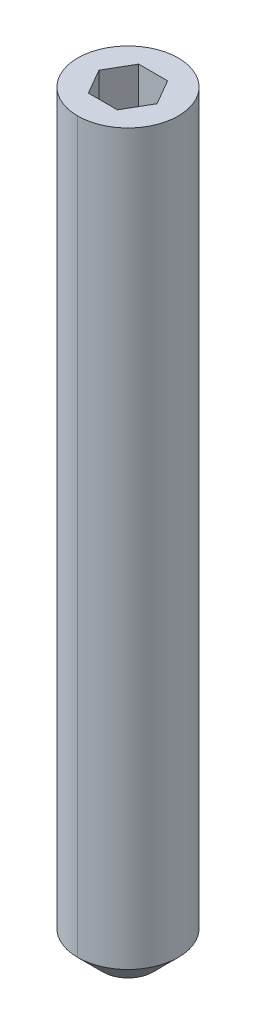
ISO-10303-21;
HEADER;
FILE_DESCRIPTION(('STEP AP214'),'2;1');
FILE_NAME('part.step','',(''),(''),'','','');
FILE_SCHEMA(('AUTOMOTIVE_DESIGN { 1 0 10303 214 1 1 1 1 }'));
ENDSEC;
DATA;
#1=APPLICATION_CONTEXT('core data for automotive mechanical design processes');
#2=APPLICATION_PROTOCOL_DEFINITION('international standard','automotive_design',2000,#1);
#3=PRODUCT_CONTEXT('',#1,'mechanical');
#4=PRODUCT('Part','Part','',(#3));
#5=PRODUCT_RELATED_PRODUCT_CATEGORY('part','',(#4));
#6=PRODUCT_DEFINITION_FORMATION('','',#4);
#7=PRODUCT_DEFINITION_CONTEXT('part definition',#1,'design');
#8=PRODUCT_DEFINITION('design','',#6,#7);
#9=PRODUCT_DEFINITION_SHAPE('','',#8);
#10=(LENGTH_UNIT() NAMED_UNIT(*) SI_UNIT(.MILLI.,.METRE.));
#11=(NAMED_UNIT(*) PLANE_ANGLE_UNIT() SI_UNIT($,.RADIAN.));
#12=(NAMED_UNIT(*) SI_UNIT($,.STERADIAN.) SOLID_ANGLE_UNIT());
#13=UNCERTAINTY_MEASURE_WITH_UNIT(LENGTH_MEASURE(1.E-05),#10,'distance_accuracy_value','');
#14=(GEOMETRIC_REPRESENTATION_CONTEXT(3) GLOBAL_UNCERTAINTY_ASSIGNED_CONTEXT((#13)) GLOBAL_UNIT_ASSIGNED_CONTEXT((#10,
#11,#12)) REPRESENTATION_CONTEXT('',''));
#15=CARTESIAN_POINT('',(0.,0.,0.));
#16=DIRECTION('',(0.,0.,1.));
#17=DIRECTION('',(1.,0.,0.));
#18=AXIS2_PLACEMENT_3D('',#15,#16,#17);
#19=CARTESIAN_POINT('',(0.577350269189626,26.,1.));
#20=DIRECTION('',(0.866025403784438,0.,0.5));
#21=DIRECTION('',(0.5,0.,-0.866025403784438));
#22=AXIS2_PLACEMENT_3D('',#19,#20,#21);
#23=PLANE('',#22);
#24=DIRECTION('',(0.5,0.,-0.866025403784438));
#25=VECTOR('',#24,1.);
#26=CARTESIAN_POINT('',(0.577350269189626,26.,1.));
#27=LINE('',#26,#25);
#28=CARTESIAN_POINT('',(0.577350269189626,26.,1.));
#29=VERTEX_POINT('',#28);
#30=CARTESIAN_POINT('',(1.15470053837925,26.,0.));
#31=VERTEX_POINT('',#30);
#32=EDGE_CURVE('E144',#29,#31,#27,.T.);
#33=ORIENTED_EDGE('',*,*,#32,.F.);
#34=DIRECTION('',(0.,1.,0.));
#35=VECTOR('',#34,1.);
#36=CARTESIAN_POINT('',(0.577350269189626,26.,1.));
#37=LINE('',#36,#35);
#38=CARTESIAN_POINT('',(0.577350269189626,30.,1.));
#39=VERTEX_POINT('',#38);
#40=EDGE_CURVE('E132',#29,#39,#37,.T.);
#41=ORIENTED_EDGE('',*,*,#40,.T.);
#42=DIRECTION('',(0.5,0.,-0.866025403784438));
#43=VECTOR('',#42,1.);
#44=CARTESIAN_POINT('',(0.577350269189626,30.,1.));
#45=LINE('',#44,#43);
#46=CARTESIAN_POINT('',(1.15470053837925,30.,0.));
#47=VERTEX_POINT('',#46);
#48=EDGE_CURVE('E146',#47,#39,#45,.F.);
#49=ORIENTED_EDGE('',*,*,#48,.F.);
#50=DIRECTION('',(0.,1.,0.));
#51=VECTOR('',#50,1.);
#52=CARTESIAN_POINT('',(1.15470053837925,26.,0.));
#53=LINE('',#52,#51);
#54=EDGE_CURVE('E139',#47,#31,#53,.F.);
#55=ORIENTED_EDGE('',*,*,#54,.T.);
#56=EDGE_LOOP('',(#33,#41,#49,#55));
#57=FACE_BOUND('',#56,.T.);
#58=ADVANCED_FACE('F17',(#57),#23,.F.);
#59=CARTESIAN_POINT('',(1.15470053837925,26.,0.));
#60=DIRECTION('',(0.866025403784438,0.,-0.5));
#61=DIRECTION('',(-0.5,0.,-0.866025403784438));
#62=AXIS2_PLACEMENT_3D('',#59,#60,#61);
#63=PLANE('',#62);
#64=DIRECTION('',(-0.5,0.,-0.866025403784438));
#65=VECTOR('',#64,1.);
#66=CARTESIAN_POINT('',(1.15470053837925,26.,0.));
#67=LINE('',#66,#65);
#68=CARTESIAN_POINT('',(0.577350269189626,26.,-1.));
#69=VERTEX_POINT('',#68);
#70=EDGE_CURVE('E137',#31,#69,#67,.T.);
#71=ORIENTED_EDGE('',*,*,#70,.F.);
#72=ORIENTED_EDGE('',*,*,#54,.F.);
#73=DIRECTION('',(-0.5,0.,-0.866025403784438));
#74=VECTOR('',#73,1.);
#75=CARTESIAN_POINT('',(1.15470053837925,30.,0.));
#76=LINE('',#75,#74);
#77=CARTESIAN_POINT('',(0.577350269189625,30.,-1.));
#78=VERTEX_POINT('',#77);
#79=EDGE_CURVE('E142',#78,#47,#76,.F.);
#80=ORIENTED_EDGE('',*,*,#79,.F.);
#81=DIRECTION('',(0.,1.,0.));
#82=VECTOR('',#81,1.);
#83=CARTESIAN_POINT('',(0.577350269189625,26.,-1.));
#84=LINE('',#83,#82);
#85=EDGE_CURVE('E127',#78,#69,#84,.F.);
#86=ORIENTED_EDGE('',*,*,#85,.T.);
#87=EDGE_LOOP('',(#71,#72,#80,#86));
#88=FACE_BOUND('',#87,.T.);
#89=ADVANCED_FACE('F179',(#88),#63,.F.);
#90=CARTESIAN_POINT('',(-0.577350269189626,26.,1.));
#91=DIRECTION('',(0.,0.,1.));
#92=DIRECTION('',(1.,0.,0.));
#93=AXIS2_PLACEMENT_3D('',#90,#91,#92);
#94=PLANE('',#93);
#95=DIRECTION('',(1.,0.,0.));
#96=VECTOR('',#95,1.);
#97=CARTESIAN_POINT('',(1.15470053837925,26.,1.));
#98=LINE('',#97,#96);
#99=CARTESIAN_POINT('',(-0.577350269189626,26.,1.));
#100=VERTEX_POINT('',#99);
#101=EDGE_CURVE('E124',#100,#29,#98,.T.);
#102=ORIENTED_EDGE('',*,*,#101,.F.);
#103=DIRECTION('',(0.,1.,0.));
#104=VECTOR('',#103,1.);
#105=CARTESIAN_POINT('',(-0.577350269189626,26.,1.));
#106=LINE('',#105,#104);
#107=CARTESIAN_POINT('',(-0.577350269189626,30.,1.));
#108=VERTEX_POINT('',#107);
#109=EDGE_CURVE('E113',#100,#108,#106,.T.);
#110=ORIENTED_EDGE('',*,*,#109,.T.);
#111=DIRECTION('',(1.,0.,0.));
#112=VECTOR('',#111,1.);
#113=CARTESIAN_POINT('',(-0.577350269189626,30.,1.));
#114=LINE('',#113,#112);
#115=EDGE_CURVE('E135',#39,#108,#114,.F.);
#116=ORIENTED_EDGE('',*,*,#115,.F.);
#117=ORIENTED_EDGE('',*,*,#40,.F.);
#118=EDGE_LOOP('',(#102,#110,#116,#117));
#119=FACE_BOUND('',#118,.T.);
#120=ADVANCED_FACE('F185',(#119),#94,.F.);
#121=CARTESIAN_POINT('',(0.577350269189625,26.,-1.));
#122=DIRECTION('',(0.,0.,-1.));
#123=DIRECTION('',(-1.,0.,0.));
#124=AXIS2_PLACEMENT_3D('',#121,#122,#123);
#125=PLANE('',#124);
#126=DIRECTION('',(1.,0.,0.));
#127=VECTOR('',#126,1.);
#128=CARTESIAN_POINT('',(1.15470053837925,26.,-1.));
#129=LINE('',#128,#127);
#130=CARTESIAN_POINT('',(-0.577350269189626,26.,-1.));
#131=VERTEX_POINT('',#130);
#132=EDGE_CURVE('E121',#69,#131,#129,.F.);
#133=ORIENTED_EDGE('',*,*,#132,.F.);
#134=ORIENTED_EDGE('',*,*,#85,.F.);
#135=DIRECTION('',(-1.,0.,0.));
#136=VECTOR('',#135,1.);
#137=CARTESIAN_POINT('',(0.577350269189625,30.,-1.));
#138=LINE('',#137,#136);
#139=CARTESIAN_POINT('',(-0.577350269189626,30.,-1.));
#140=VERTEX_POINT('',#139);
#141=EDGE_CURVE('E130',#140,#78,#138,.F.);
#142=ORIENTED_EDGE('',*,*,#141,.F.);
#143=DIRECTION('',(0.,1.,0.));
#144=VECTOR('',#143,1.);
#145=CARTESIAN_POINT('',(-0.577350269189626,26.,-1.));
#146=LINE('',#145,#144);
#147=EDGE_CURVE('E111',#140,#131,#146,.F.);
#148=ORIENTED_EDGE('',*,*,#147,.T.);
#149=EDGE_LOOP('',(#133,#134,#142,#148));
#150=FACE_BOUND('',#149,.T.);
#151=ADVANCED_FACE('F171',(#150),#125,.F.);
#152=CARTESIAN_POINT('',(1.15470053837925,26.,0.));
#153=DIRECTION('',(0.,1.,0.));
#154=DIRECTION('',(0.,0.,1.));
#155=AXIS2_PLACEMENT_3D('',#152,#153,#154);
#156=PLANE('',#155);
#157=ORIENTED_EDGE('',*,*,#132,.T.);
#158=DIRECTION('',(-0.5,0.,0.866025403784439));
#159=VECTOR('',#158,1.);
#160=CARTESIAN_POINT('',(-0.577350269189626,26.,-1.));
#161=LINE('',#160,#159);
#162=CARTESIAN_POINT('',(-1.15470053837925,26.,0.));
#163=VERTEX_POINT('',#162);
#164=EDGE_CURVE('E109',#131,#163,#161,.T.);
#165=ORIENTED_EDGE('',*,*,#164,.T.);
#166=DIRECTION('',(0.5,0.,0.866025403784439));
#167=VECTOR('',#166,1.);
#168=CARTESIAN_POINT('',(-1.15470053837925,26.,0.));
#169=LINE('',#168,#167);
#170=EDGE_CURVE('E116',#163,#100,#169,.T.);
#171=ORIENTED_EDGE('',*,*,#170,.T.);
#172=ORIENTED_EDGE('',*,*,#101,.T.);
#173=ORIENTED_EDGE('',*,*,#32,.T.);
#174=ORIENTED_EDGE('',*,*,#70,.T.);
#175=EDGE_LOOP('',(#157,#165,#171,#172,#173,#174));
#176=FACE_BOUND('',#175,.T.);
#177=ADVANCED_FACE('F174',(#176),#156,.T.);
#178=CARTESIAN_POINT('',(-1.15470053837925,26.,0.));
#179=DIRECTION('',(-0.866025403784439,0.,0.5));
#180=DIRECTION('',(0.5,0.,0.866025403784439));
#181=AXIS2_PLACEMENT_3D('',#178,#179,#180);
#182=PLANE('',#181);
#183=ORIENTED_EDGE('',*,*,#170,.F.);
#184=DIRECTION('',(0.,1.,0.));
#185=VECTOR('',#184,1.);
#186=CARTESIAN_POINT('',(-1.15470053837925,26.,0.));
#187=LINE('',#186,#185);
#188=CARTESIAN_POINT('',(-1.15470053837925,30.,0.));
#189=VERTEX_POINT('',#188);
#190=EDGE_CURVE('E94',#163,#189,#187,.T.);
#191=ORIENTED_EDGE('',*,*,#190,.T.);
#192=DIRECTION('',(0.5,0.,0.866025403784439));
#193=VECTOR('',#192,1.);
#194=CARTESIAN_POINT('',(-1.15470053837925,30.,0.));
#195=LINE('',#194,#193);
#196=EDGE_CURVE('E119',#108,#189,#195,.F.);
#197=ORIENTED_EDGE('',*,*,#196,.F.);
#198=ORIENTED_EDGE('',*,*,#109,.F.);
#199=EDGE_LOOP('',(#183,#191,#197,#198));
#200=FACE_BOUND('',#199,.T.);
#201=ADVANCED_FACE('F188',(#200),#182,.F.);
#202=CARTESIAN_POINT('',(-0.577350269189626,26.,-1.));
#203=DIRECTION('',(-0.866025403784439,0.,-0.5));
#204=DIRECTION('',(-0.5,0.,0.866025403784439));
#205=AXIS2_PLACEMENT_3D('',#202,#203,#204);
#206=PLANE('',#205);
#207=ORIENTED_EDGE('',*,*,#164,.F.);
#208=ORIENTED_EDGE('',*,*,#147,.F.);
#209=DIRECTION('',(0.5,0.,-0.866025403784439));
#210=VECTOR('',#209,1.);
#211=CARTESIAN_POINT('',(-1.15470053837925,30.,0.));
#212=LINE('',#211,#210);
#213=EDGE_CURVE('E91',#189,#140,#212,.T.);
#214=ORIENTED_EDGE('',*,*,#213,.F.);
#215=ORIENTED_EDGE('',*,*,#190,.F.);
#216=EDGE_LOOP('',(#207,#208,#214,#215));
#217=FACE_BOUND('',#216,.T.);
#218=ADVANCED_FACE('F168',(#217),#206,.F.);
#219=CARTESIAN_POINT('',(0.,0.,0.));
#220=DIRECTION('',(0.,-1.,0.));
#221=DIRECTION('',(0.,0.,-1.));
#222=AXIS2_PLACEMENT_3D('',#219,#220,#221);
#223=PLANE('',#222);
#224=CARTESIAN_POINT('',(0.,5.6843418860808E-11,0.));
#225=DIRECTION('',(0.,1.,0.));
#226=DIRECTION('',(0.,0.,1.));
#227=AXIS2_PLACEMENT_3D('',#224,#225,#226);
#228=CIRCLE('',#227,0.999999999862666);
#229=CARTESIAN_POINT('',(0.,5.6843418860808E-11,0.999999999862666));
#230=VERTEX_POINT('',#229);
#231=CARTESIAN_POINT('',(0.,5.6843418860808E-11,-0.999999999862666));
#232=VERTEX_POINT('',#231);
#233=EDGE_CURVE('E86',#230,#232,#228,.T.);
#234=ORIENTED_EDGE('',*,*,#233,.F.);
#235=CARTESIAN_POINT('',(0.,5.6843418860808E-11,0.));
#236=DIRECTION('',(0.,1.,0.));
#237=DIRECTION('',(0.,0.,1.));
#238=AXIS2_PLACEMENT_3D('',#235,#236,#237);
#239=CIRCLE('',#238,0.999999999862666);
#240=EDGE_CURVE('E20',#232,#230,#239,.T.);
#241=ORIENTED_EDGE('',*,*,#240,.F.);
#242=EDGE_LOOP('',(#234,#241));
#243=FACE_BOUND('',#242,.T.);
#244=ADVANCED_FACE('F87',(#243),#223,.T.);
#245=CARTESIAN_POINT('',(0.,1.0000000000332,0.));
#246=DIRECTION('',(0.,1.,0.));
#247=DIRECTION('',(0.,0.,1.));
#248=AXIS2_PLACEMENT_3D('',#245,#246,#247);
#249=CONICAL_SURFACE('',#248,1.99999999989586,0.78539816342587);
#250=DIRECTION('',(0.,-0.707106781186548,-0.707106781186547));
#251=VECTOR('',#250,1.);
#252=CARTESIAN_POINT('',(0.,498999.,499000.));
#253=LINE('',#252,#251);
#254=CARTESIAN_POINT('',(0.,1.00000000002075,1.99999999993491));
#255=VERTEX_POINT('',#254);
#256=EDGE_CURVE('E93',#255,#230,#253,.T.);
#257=ORIENTED_EDGE('',*,*,#256,.F.);
#258=CARTESIAN_POINT('',(0.,1.,0.));
#259=DIRECTION('',(0.,-1.,0.));
#260=DIRECTION('',(0.,0.,-1.));
#261=AXIS2_PLACEMENT_3D('',#258,#259,#260);
#262=CIRCLE('',#261,2.);
#263=CARTESIAN_POINT('',(0.,1.0000000000249,-1.9999999999219));
#264=VERTEX_POINT('',#263);
#265=EDGE_CURVE('E35',#264,#255,#262,.F.);
#266=ORIENTED_EDGE('',*,*,#265,.F.);
#267=DIRECTION('',(0.,-0.707106781186548,0.707106781186547));
#268=VECTOR('',#267,1.);
#269=CARTESIAN_POINT('',(6.11098752774529E-11,498999.,-499000.));
#270=LINE('',#269,#268);
#271=EDGE_CURVE('E90',#232,#264,#270,.F.);
#272=ORIENTED_EDGE('',*,*,#271,.F.);
#273=ORIENTED_EDGE('',*,*,#240,.T.);
#274=EDGE_LOOP('',(#257,#266,#272,#273));
#275=FACE_BOUND('',#274,.T.);
#276=ADVANCED_FACE('F92',(#275),#249,.T.);
#277=CARTESIAN_POINT('',(0.,30.,-2.));
#278=DIRECTION('',(0.,1.,0.));
#279=DIRECTION('',(0.,0.,1.));
#280=AXIS2_PLACEMENT_3D('',#277,#278,#279);
#281=PLANE('',#280);
#282=ORIENTED_EDGE('',*,*,#196,.T.);
#283=ORIENTED_EDGE('',*,*,#213,.T.);
#284=ORIENTED_EDGE('',*,*,#141,.T.);
#285=ORIENTED_EDGE('',*,*,#79,.T.);
#286=ORIENTED_EDGE('',*,*,#48,.T.);
#287=ORIENTED_EDGE('',*,*,#115,.T.);
#288=EDGE_LOOP('',(#282,#283,#284,#285,#286,#287));
#289=FACE_BOUND('',#288,.T.);
#290=CARTESIAN_POINT('',(0.,30.,0.));
#291=DIRECTION('',(0.,-1.,0.));
#292=DIRECTION('',(0.,0.,-1.));
#293=AXIS2_PLACEMENT_3D('',#290,#291,#292);
#294=CIRCLE('',#293,2.);
#295=CARTESIAN_POINT('',(0.,30.,-2.));
#296=VERTEX_POINT('',#295);
#297=CARTESIAN_POINT('',(0.,30.,2.));
#298=VERTEX_POINT('',#297);
#299=EDGE_CURVE('E148',#296,#298,#294,.T.);
#300=ORIENTED_EDGE('',*,*,#299,.F.);
#301=CARTESIAN_POINT('',(0.,30.,0.));
#302=DIRECTION('',(0.,-1.,0.));
#303=DIRECTION('',(0.,0.,-1.));
#304=AXIS2_PLACEMENT_3D('',#301,#302,#303);
#305=CIRCLE('',#304,2.);
#306=EDGE_CURVE('E99',#298,#296,#305,.T.);
#307=ORIENTED_EDGE('',*,*,#306,.F.);
#308=EDGE_LOOP('',(#300,#307));
#309=FACE_BOUND('',#308,.T.);
#310=ADVANCED_FACE('F160',(#289,#309),#281,.T.);
#311=CARTESIAN_POINT('',(0.,1.0000000000332,0.));
#312=DIRECTION('',(0.,1.,0.));
#313=DIRECTION('',(0.,0.,1.));
#314=AXIS2_PLACEMENT_3D('',#311,#312,#313);
#315=CONICAL_SURFACE('',#314,1.99999999989586,0.78539816342587);
#316=CARTESIAN_POINT('',(0.,1.,0.));
#317=DIRECTION('',(0.,-1.,0.));
#318=DIRECTION('',(0.,0.,-1.));
#319=AXIS2_PLACEMENT_3D('',#316,#317,#318);
#320=CIRCLE('',#319,2.);
#321=EDGE_CURVE('E26',#255,#264,#320,.F.);
#322=ORIENTED_EDGE('',*,*,#321,.F.);
#323=ORIENTED_EDGE('',*,*,#256,.T.);
#324=ORIENTED_EDGE('',*,*,#233,.T.);
#325=ORIENTED_EDGE('',*,*,#271,.T.);
#326=EDGE_LOOP('',(#322,#323,#324,#325));
#327=FACE_BOUND('',#326,.T.);
#328=ADVANCED_FACE('F96',(#327),#315,.T.);
#329=CARTESIAN_POINT('',(0.,0.,0.));
#330=DIRECTION('',(0.,-1.,0.));
#331=DIRECTION('',(0.,0.,-1.));
#332=AXIS2_PLACEMENT_3D('',#329,#330,#331);
#333=CYLINDRICAL_SURFACE('',#332,2.);
#334=DIRECTION('',(0.,-1.,0.));
#335=VECTOR('',#334,1.);
#336=CARTESIAN_POINT('',(0.,0.,-2.));
#337=LINE('',#336,#335);
#338=EDGE_CURVE('E11',#264,#296,#337,.F.);
#339=ORIENTED_EDGE('',*,*,#338,.F.);
#340=ORIENTED_EDGE('',*,*,#265,.T.);
#341=DIRECTION('',(0.,-1.,0.));
#342=VECTOR('',#341,1.);
#343=CARTESIAN_POINT('',(0.,0.,2.));
#344=LINE('',#343,#342);
#345=EDGE_CURVE('E105',#298,#255,#344,.T.);
#346=ORIENTED_EDGE('',*,*,#345,.F.);
#347=ORIENTED_EDGE('',*,*,#306,.T.);
#348=EDGE_LOOP('',(#339,#340,#346,#347));
#349=FACE_BOUND('',#348,.T.);
#350=ADVANCED_FACE('F200',(#349),#333,.T.);
#351=CARTESIAN_POINT('',(0.,0.,0.));
#352=DIRECTION('',(0.,-1.,0.));
#353=DIRECTION('',(0.,0.,-1.));
#354=AXIS2_PLACEMENT_3D('',#351,#352,#353);
#355=CYLINDRICAL_SURFACE('',#354,2.);
#356=ORIENTED_EDGE('',*,*,#321,.T.);
#357=ORIENTED_EDGE('',*,*,#338,.T.);
#358=ORIENTED_EDGE('',*,*,#299,.T.);
#359=ORIENTED_EDGE('',*,*,#345,.T.);
#360=EDGE_LOOP('',(#356,#357,#358,#359));
#361=FACE_BOUND('',#360,.T.);
#362=ADVANCED_FACE('F198',(#361),#355,.T.);
#363=CLOSED_SHELL('',(#58,#89,#120,#151,#177,#201,#218,#244,#276,#310,#328,#350,#362));
#364=MANIFOLD_SOLID_BREP('B1',#363);
#365=ADVANCED_BREP_SHAPE_REPRESENTATION('',(#18,#364),#14);
#366=SHAPE_DEFINITION_REPRESENTATION(#9,#365);
ENDSEC;
END-ISO-10303-21;
